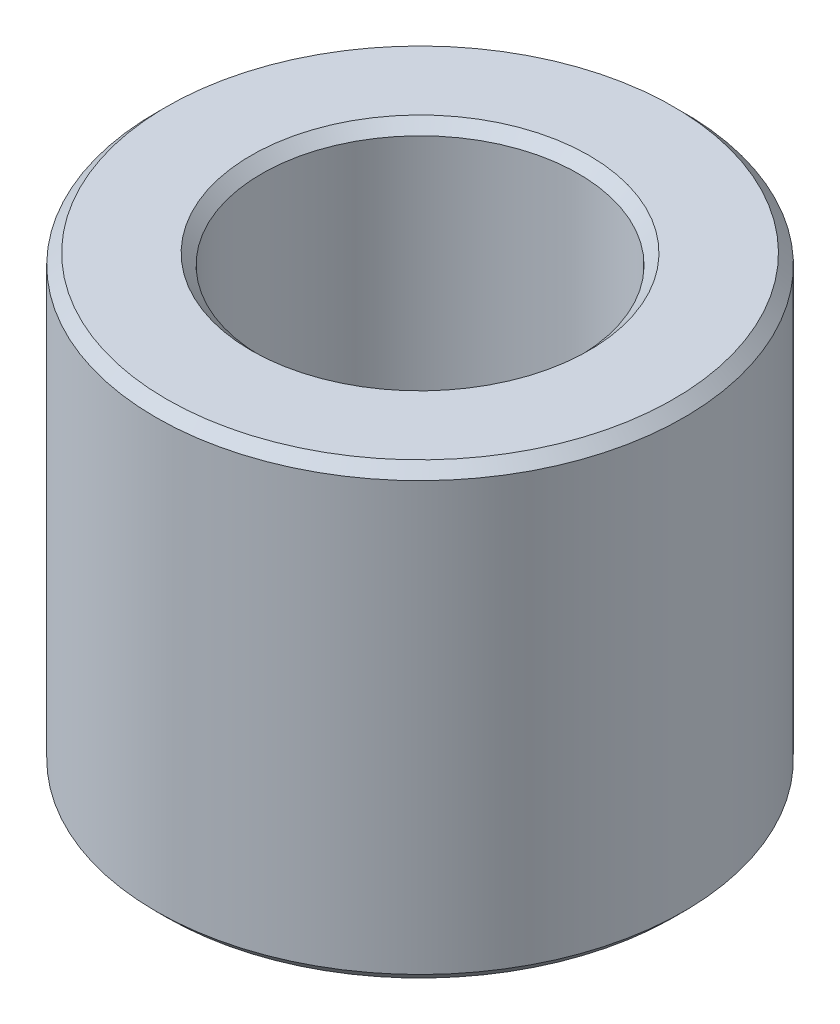
ISO-10303-21;
HEADER;
FILE_DESCRIPTION(('STEP AP214'),'2;1');
FILE_NAME('part.step','',(''),(''),'','','');
FILE_SCHEMA(('AUTOMOTIVE_DESIGN { 1 0 10303 214 1 1 1 1 }'));
ENDSEC;
DATA;
#1=APPLICATION_CONTEXT('core data for automotive mechanical design processes');
#2=APPLICATION_PROTOCOL_DEFINITION('international standard','automotive_design',2000,#1);
#3=PRODUCT_CONTEXT('',#1,'mechanical');
#4=PRODUCT('Part','Part','',(#3));
#5=PRODUCT_RELATED_PRODUCT_CATEGORY('part','',(#4));
#6=PRODUCT_DEFINITION_FORMATION('','',#4);
#7=PRODUCT_DEFINITION_CONTEXT('part definition',#1,'design');
#8=PRODUCT_DEFINITION('design','',#6,#7);
#9=PRODUCT_DEFINITION_SHAPE('','',#8);
#10=(LENGTH_UNIT() NAMED_UNIT(*) SI_UNIT(.MILLI.,.METRE.));
#11=(NAMED_UNIT(*) PLANE_ANGLE_UNIT() SI_UNIT($,.RADIAN.));
#12=(NAMED_UNIT(*) SI_UNIT($,.STERADIAN.) SOLID_ANGLE_UNIT());
#13=UNCERTAINTY_MEASURE_WITH_UNIT(LENGTH_MEASURE(1.E-05),#10,'distance_accuracy_value','');
#14=(GEOMETRIC_REPRESENTATION_CONTEXT(3) GLOBAL_UNCERTAINTY_ASSIGNED_CONTEXT((#13)) GLOBAL_UNIT_ASSIGNED_CONTEXT((#10,
#11,#12)) REPRESENTATION_CONTEXT('',''));
#15=CARTESIAN_POINT('',(0.,0.,0.));
#16=DIRECTION('',(0.,0.,1.));
#17=DIRECTION('',(1.,0.,0.));
#18=AXIS2_PLACEMENT_3D('',#15,#16,#17);
#19=CARTESIAN_POINT('',(0.,8.5,0.));
#20=DIRECTION('',(0.,1.,0.));
#21=DIRECTION('',(0.,0.,1.));
#22=AXIS2_PLACEMENT_3D('',#19,#20,#21);
#23=PLANE('',#22);
#24=CARTESIAN_POINT('',(0.,8.5,0.));
#25=DIRECTION('',(0.,1.,0.));
#26=DIRECTION('',(0.,0.,1.));
#27=AXIS2_PLACEMENT_3D('',#24,#25,#26);
#28=CIRCLE('',#27,3.2);
#29=CARTESIAN_POINT('',(0.,8.5,3.2));
#30=VERTEX_POINT('',#29);
#31=EDGE_CURVE('E51',#30,#30,#28,.F.);
#32=ORIENTED_EDGE('',*,*,#31,.T.);
#33=EDGE_LOOP('',(#32));
#34=FACE_BOUND('',#33,.T.);
#35=CARTESIAN_POINT('',(0.,8.5,0.));
#36=DIRECTION('',(0.,1.,0.));
#37=DIRECTION('',(0.,0.,1.));
#38=AXIS2_PLACEMENT_3D('',#35,#36,#37);
#39=CIRCLE('',#38,4.8);
#40=CARTESIAN_POINT('',(0.,8.5,4.8));
#41=VERTEX_POINT('',#40);
#42=EDGE_CURVE('E54',#41,#41,#39,.T.);
#43=ORIENTED_EDGE('',*,*,#42,.T.);
#44=EDGE_LOOP('',(#43));
#45=FACE_BOUND('',#44,.T.);
#46=ADVANCED_FACE('F31',(#34,#45),#23,.T.);
#47=CARTESIAN_POINT('',(0.,0.,0.));
#48=DIRECTION('',(0.,1.,0.));
#49=DIRECTION('',(0.,0.,1.));
#50=AXIS2_PLACEMENT_3D('',#47,#48,#49);
#51=PLANE('',#50);
#52=CARTESIAN_POINT('',(0.,0.,0.));
#53=DIRECTION('',(0.,1.,0.));
#54=DIRECTION('',(0.,0.,1.));
#55=AXIS2_PLACEMENT_3D('',#52,#53,#54);
#56=CIRCLE('',#55,3.2);
#57=CARTESIAN_POINT('',(0.,0.,3.2));
#58=VERTEX_POINT('',#57);
#59=EDGE_CURVE('E10',#58,#58,#56,.T.);
#60=ORIENTED_EDGE('',*,*,#59,.T.);
#61=EDGE_LOOP('',(#60));
#62=FACE_BOUND('',#61,.T.);
#63=CARTESIAN_POINT('',(0.,0.,0.));
#64=DIRECTION('',(0.,1.,0.));
#65=DIRECTION('',(0.,0.,1.));
#66=AXIS2_PLACEMENT_3D('',#63,#64,#65);
#67=CIRCLE('',#66,4.8);
#68=CARTESIAN_POINT('',(0.,0.,4.8));
#69=VERTEX_POINT('',#68);
#70=EDGE_CURVE('E38',#69,#69,#67,.F.);
#71=ORIENTED_EDGE('',*,*,#70,.T.);
#72=EDGE_LOOP('',(#71));
#73=FACE_BOUND('',#72,.T.);
#74=ADVANCED_FACE('F79',(#62,#73),#51,.F.);
#75=CARTESIAN_POINT('',(0.,8.5,0.));
#76=DIRECTION('',(0.,-1.,0.));
#77=DIRECTION('',(0.,0.,-1.));
#78=AXIS2_PLACEMENT_3D('',#75,#76,#77);
#79=CYLINDRICAL_SURFACE('',#78,5.);
#80=CARTESIAN_POINT('',(0.,8.3,0.));
#81=DIRECTION('',(0.,1.,0.));
#82=DIRECTION('',(0.,0.,1.));
#83=AXIS2_PLACEMENT_3D('',#80,#81,#82);
#84=CIRCLE('',#83,5.);
#85=CARTESIAN_POINT('',(0.,8.3,5.));
#86=VERTEX_POINT('',#85);
#87=EDGE_CURVE('E42',#86,#86,#84,.F.);
#88=ORIENTED_EDGE('',*,*,#87,.T.);
#89=EDGE_LOOP('',(#88));
#90=FACE_BOUND('',#89,.T.);
#91=CARTESIAN_POINT('',(0.,0.199999999999999,0.));
#92=DIRECTION('',(0.,1.,0.));
#93=DIRECTION('',(0.,0.,1.));
#94=AXIS2_PLACEMENT_3D('',#91,#92,#93);
#95=CIRCLE('',#94,5.);
#96=CARTESIAN_POINT('',(0.,0.199999999999999,5.));
#97=VERTEX_POINT('',#96);
#98=EDGE_CURVE('E46',#97,#97,#95,.T.);
#99=ORIENTED_EDGE('',*,*,#98,.T.);
#100=EDGE_LOOP('',(#99));
#101=FACE_BOUND('',#100,.T.);
#102=ADVANCED_FACE('F85',(#90,#101),#79,.T.);
#103=CARTESIAN_POINT('',(0.,8.5,0.));
#104=DIRECTION('',(0.,-1.,0.));
#105=DIRECTION('',(0.,0.,-1.));
#106=AXIS2_PLACEMENT_3D('',#103,#104,#105);
#107=CYLINDRICAL_SURFACE('',#106,3.);
#108=CARTESIAN_POINT('',(0.,8.3,0.));
#109=DIRECTION('',(0.,1.,0.));
#110=DIRECTION('',(0.,0.,1.));
#111=AXIS2_PLACEMENT_3D('',#108,#109,#110);
#112=CIRCLE('',#111,3.);
#113=CARTESIAN_POINT('',(0.,8.3,3.));
#114=VERTEX_POINT('',#113);
#115=EDGE_CURVE('E57',#114,#114,#112,.T.);
#116=ORIENTED_EDGE('',*,*,#115,.T.);
#117=EDGE_LOOP('',(#116));
#118=FACE_BOUND('',#117,.T.);
#119=CARTESIAN_POINT('',(0.,0.200000000000002,0.));
#120=DIRECTION('',(0.,1.,0.));
#121=DIRECTION('',(0.,0.,1.));
#122=AXIS2_PLACEMENT_3D('',#119,#120,#121);
#123=CIRCLE('',#122,3.);
#124=CARTESIAN_POINT('',(0.,0.200000000000002,3.));
#125=VERTEX_POINT('',#124);
#126=EDGE_CURVE('E60',#125,#125,#123,.F.);
#127=ORIENTED_EDGE('',*,*,#126,.T.);
#128=EDGE_LOOP('',(#127));
#129=FACE_BOUND('',#128,.T.);
#130=ADVANCED_FACE('F64',(#118,#129),#107,.F.);
#131=CARTESIAN_POINT('',(0.,8.3,0.));
#132=DIRECTION('',(0.,1.,0.));
#133=DIRECTION('',(0.,0.,1.));
#134=AXIS2_PLACEMENT_3D('',#131,#132,#133);
#135=CONICAL_SURFACE('',#134,3.,0.785398163397443);
#136=ORIENTED_EDGE('',*,*,#31,.F.);
#137=EDGE_LOOP('',(#136));
#138=FACE_BOUND('',#137,.T.);
#139=ORIENTED_EDGE('',*,*,#115,.F.);
#140=EDGE_LOOP('',(#139));
#141=FACE_BOUND('',#140,.T.);
#142=ADVANCED_FACE('F75',(#138,#141),#135,.F.);
#143=CARTESIAN_POINT('',(0.,8.5,0.));
#144=DIRECTION('',(0.,-1.,0.));
#145=DIRECTION('',(0.,0.,-1.));
#146=AXIS2_PLACEMENT_3D('',#143,#144,#145);
#147=CONICAL_SURFACE('',#146,4.8,0.785398163397444);
#148=ORIENTED_EDGE('',*,*,#87,.F.);
#149=EDGE_LOOP('',(#148));
#150=FACE_BOUND('',#149,.T.);
#151=ORIENTED_EDGE('',*,*,#42,.F.);
#152=EDGE_LOOP('',(#151));
#153=FACE_BOUND('',#152,.T.);
#154=ADVANCED_FACE('F69',(#150,#153),#147,.T.);
#155=CARTESIAN_POINT('',(0.,0.,0.));
#156=DIRECTION('',(0.,-1.,0.));
#157=DIRECTION('',(0.,0.,-1.));
#158=AXIS2_PLACEMENT_3D('',#155,#156,#157);
#159=CONICAL_SURFACE('',#158,3.2,0.785398163397444);
#160=ORIENTED_EDGE('',*,*,#126,.F.);
#161=EDGE_LOOP('',(#160));
#162=FACE_BOUND('',#161,.T.);
#163=ORIENTED_EDGE('',*,*,#59,.F.);
#164=EDGE_LOOP('',(#163));
#165=FACE_BOUND('',#164,.T.);
#166=ADVANCED_FACE('F66',(#162,#165),#159,.F.);
#167=CARTESIAN_POINT('',(0.,0.199999999999999,0.));
#168=DIRECTION('',(0.,1.,0.));
#169=DIRECTION('',(0.,0.,1.));
#170=AXIS2_PLACEMENT_3D('',#167,#168,#169);
#171=CONICAL_SURFACE('',#170,5.,0.785398163397453);
#172=ORIENTED_EDGE('',*,*,#70,.F.);
#173=EDGE_LOOP('',(#172));
#174=FACE_BOUND('',#173,.T.);
#175=ORIENTED_EDGE('',*,*,#98,.F.);
#176=EDGE_LOOP('',(#175));
#177=FACE_BOUND('',#176,.T.);
#178=ADVANCED_FACE('F33',(#174,#177),#171,.T.);
#179=CLOSED_SHELL('',(#46,#74,#102,#130,#142,#154,#166,#178));
#180=MANIFOLD_SOLID_BREP('B2',#179);
#181=ADVANCED_BREP_SHAPE_REPRESENTATION('',(#18,#180),#14);
#182=SHAPE_DEFINITION_REPRESENTATION(#9,#181);
ENDSEC;
END-ISO-10303-21;
